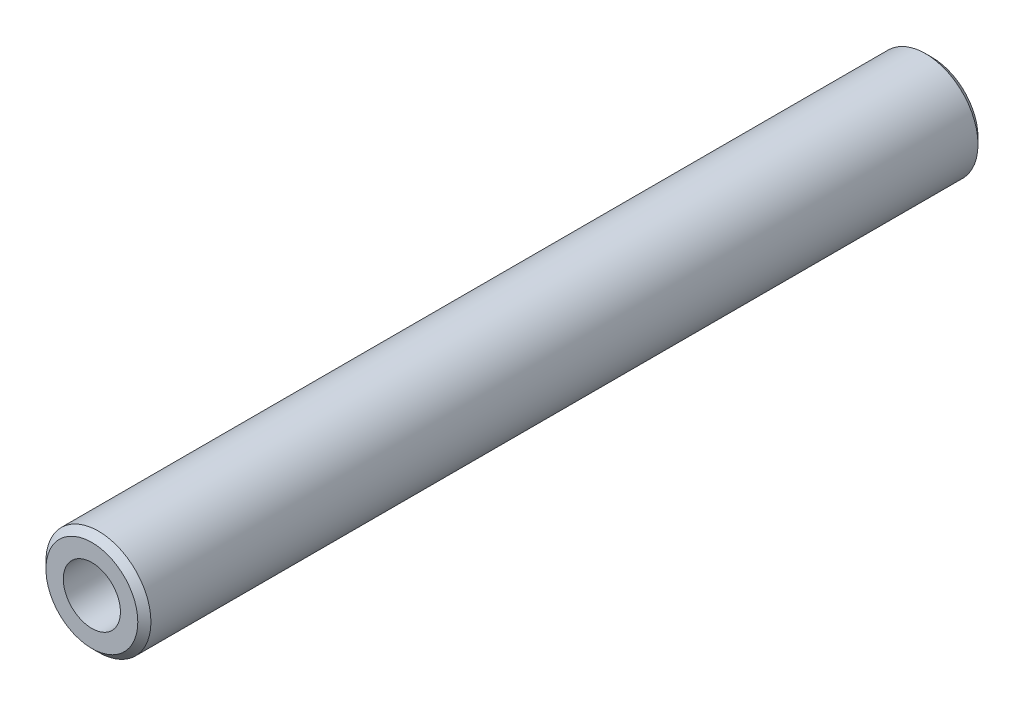
ISO-10303-21;
HEADER;
FILE_DESCRIPTION(('STEP AP214'),'2;1');
FILE_NAME('part.step','',(''),(''),'','','');
FILE_SCHEMA(('AUTOMOTIVE_DESIGN { 1 0 10303 214 1 1 1 1 }'));
ENDSEC;
DATA;
#1=APPLICATION_CONTEXT('core data for automotive mechanical design processes');
#2=APPLICATION_PROTOCOL_DEFINITION('international standard','automotive_design',2000,#1);
#3=PRODUCT_CONTEXT('',#1,'mechanical');
#4=PRODUCT('Part','Part','',(#3));
#5=PRODUCT_RELATED_PRODUCT_CATEGORY('part','',(#4));
#6=PRODUCT_DEFINITION_FORMATION('','',#4);
#7=PRODUCT_DEFINITION_CONTEXT('part definition',#1,'design');
#8=PRODUCT_DEFINITION('design','',#6,#7);
#9=PRODUCT_DEFINITION_SHAPE('','',#8);
#10=(LENGTH_UNIT() NAMED_UNIT(*) SI_UNIT(.MILLI.,.METRE.));
#11=(NAMED_UNIT(*) PLANE_ANGLE_UNIT() SI_UNIT($,.RADIAN.));
#12=(NAMED_UNIT(*) SI_UNIT($,.STERADIAN.) SOLID_ANGLE_UNIT());
#13=UNCERTAINTY_MEASURE_WITH_UNIT(LENGTH_MEASURE(1.E-05),#10,'distance_accuracy_value','');
#14=(GEOMETRIC_REPRESENTATION_CONTEXT(3) GLOBAL_UNCERTAINTY_ASSIGNED_CONTEXT((#13)) GLOBAL_UNIT_ASSIGNED_CONTEXT((#10,
#11,#12)) REPRESENTATION_CONTEXT('',''));
#15=CARTESIAN_POINT('',(0.,0.,0.));
#16=DIRECTION('',(0.,0.,1.));
#17=DIRECTION('',(1.,0.,0.));
#18=AXIS2_PLACEMENT_3D('',#15,#16,#17);
#19=CARTESIAN_POINT('',(0.,0.,25.4));
#20=DIRECTION('',(0.,0.,-1.));
#21=DIRECTION('',(-1.,0.,0.));
#22=AXIS2_PLACEMENT_3D('',#19,#20,#21);
#23=CYLINDRICAL_SURFACE('',#22,3.175);
#24=CARTESIAN_POINT('',(0.,0.,-25.003125));
#25=DIRECTION('',(0.,0.,1.));
#26=DIRECTION('',(1.,0.,0.));
#27=AXIS2_PLACEMENT_3D('',#24,#25,#26);
#28=CIRCLE('',#27,3.175);
#29=CARTESIAN_POINT('',(3.175,0.,-25.003125));
#30=VERTEX_POINT('',#29);
#31=EDGE_CURVE('E73',#30,#30,#28,.T.);
#32=ORIENTED_EDGE('',*,*,#31,.T.);
#33=EDGE_LOOP('',(#32));
#34=FACE_BOUND('',#33,.T.);
#35=CARTESIAN_POINT('',(0.,0.,25.003125));
#36=DIRECTION('',(0.,0.,1.));
#37=DIRECTION('',(1.,0.,0.));
#38=AXIS2_PLACEMENT_3D('',#35,#36,#37);
#39=CIRCLE('',#38,3.175);
#40=CARTESIAN_POINT('',(3.175,0.,25.003125));
#41=VERTEX_POINT('',#40);
#42=EDGE_CURVE('E70',#41,#41,#39,.F.);
#43=ORIENTED_EDGE('',*,*,#42,.T.);
#44=EDGE_LOOP('',(#43));
#45=FACE_BOUND('',#44,.T.);
#46=ADVANCED_FACE('F35',(#34,#45),#23,.T.);
#47=CARTESIAN_POINT('',(0.,0.,25.4));
#48=DIRECTION('',(0.,0.,1.));
#49=DIRECTION('',(1.,0.,0.));
#50=AXIS2_PLACEMENT_3D('',#47,#48,#49);
#51=PLANE('',#50);
#52=CARTESIAN_POINT('',(0.,0.,25.4));
#53=DIRECTION('',(0.,0.,1.));
#54=DIRECTION('',(1.,0.,0.));
#55=AXIS2_PLACEMENT_3D('',#52,#53,#54);
#56=CIRCLE('',#55,2.77812499999999);
#57=CARTESIAN_POINT('',(2.77812499999999,0.,25.4));
#58=VERTEX_POINT('',#57);
#59=EDGE_CURVE('E11',#58,#58,#56,.T.);
#60=ORIENTED_EDGE('',*,*,#59,.T.);
#61=EDGE_LOOP('',(#60));
#62=FACE_BOUND('',#61,.T.);
#63=CARTESIAN_POINT('',(0.,0.,25.4));
#64=DIRECTION('',(0.,0.,1.));
#65=DIRECTION('',(1.,0.,0.));
#66=AXIS2_PLACEMENT_3D('',#63,#64,#65);
#67=CIRCLE('',#66,1.72719999999999);
#68=CARTESIAN_POINT('',(1.72719999999999,0.,25.4));
#69=VERTEX_POINT('',#68);
#70=EDGE_CURVE('E60',#69,#69,#67,.T.);
#71=ORIENTED_EDGE('',*,*,#70,.F.);
#72=EDGE_LOOP('',(#71));
#73=FACE_BOUND('',#72,.T.);
#74=ADVANCED_FACE('F88',(#62,#73),#51,.T.);
#75=CARTESIAN_POINT('',(0.,0.,-25.4));
#76=DIRECTION('',(0.,0.,1.));
#77=DIRECTION('',(1.,0.,0.));
#78=AXIS2_PLACEMENT_3D('',#75,#76,#77);
#79=PLANE('',#78);
#80=CARTESIAN_POINT('',(0.,0.,-25.4));
#81=DIRECTION('',(0.,0.,1.));
#82=DIRECTION('',(1.,0.,0.));
#83=AXIS2_PLACEMENT_3D('',#80,#81,#82);
#84=CIRCLE('',#83,2.77812500000001);
#85=CARTESIAN_POINT('',(2.77812500000001,0.,-25.4));
#86=VERTEX_POINT('',#85);
#87=EDGE_CURVE('E43',#86,#86,#84,.F.);
#88=ORIENTED_EDGE('',*,*,#87,.T.);
#89=EDGE_LOOP('',(#88));
#90=FACE_BOUND('',#89,.T.);
#91=CARTESIAN_POINT('',(0.,0.,-25.4));
#92=DIRECTION('',(0.,0.,-1.));
#93=DIRECTION('',(-1.,0.,0.));
#94=AXIS2_PLACEMENT_3D('',#91,#92,#93);
#95=CIRCLE('',#94,1.72719999999999);
#96=CARTESIAN_POINT('',(-1.72719999999999,0.,-25.4));
#97=VERTEX_POINT('',#96);
#98=EDGE_CURVE('E59',#97,#97,#95,.T.);
#99=ORIENTED_EDGE('',*,*,#98,.F.);
#100=EDGE_LOOP('',(#99));
#101=FACE_BOUND('',#100,.T.);
#102=ADVANCED_FACE('F78',(#90,#101),#79,.F.);
#103=CARTESIAN_POINT('',(0.,0.,-19.05));
#104=DIRECTION('',(0.,0.,-1.));
#105=DIRECTION('',(-1.,0.,0.));
#106=AXIS2_PLACEMENT_3D('',#103,#104,#105);
#107=CONICAL_SURFACE('',#106,1.7272,1.02974425867666);
#108=CARTESIAN_POINT('',(0.,0.,-18.0121935388156));
#109=VERTEX_POINT('',#108);
#110=VERTEX_LOOP('',#109);
#111=FACE_BOUND('',#110,.T.);
#112=CARTESIAN_POINT('',(0.,0.,-19.05));
#113=DIRECTION('',(0.,0.,-1.));
#114=DIRECTION('',(-1.,0.,0.));
#115=AXIS2_PLACEMENT_3D('',#112,#113,#114);
#116=CIRCLE('',#115,1.7272);
#117=CARTESIAN_POINT('',(-1.7272,0.,-19.05));
#118=VERTEX_POINT('',#117);
#119=EDGE_CURVE('E63',#118,#118,#116,.T.);
#120=ORIENTED_EDGE('',*,*,#119,.T.);
#121=EDGE_LOOP('',(#120));
#122=FACE_BOUND('',#121,.T.);
#123=ADVANCED_FACE('F108',(#111,#122),#107,.F.);
#124=CARTESIAN_POINT('',(0.,0.,-25.4));
#125=DIRECTION('',(0.,0.,-1.));
#126=DIRECTION('',(-1.,0.,0.));
#127=AXIS2_PLACEMENT_3D('',#124,#125,#126);
#128=CYLINDRICAL_SURFACE('',#127,1.72719999999999);
#129=ORIENTED_EDGE('',*,*,#119,.F.);
#130=EDGE_LOOP('',(#129));
#131=FACE_BOUND('',#130,.T.);
#132=ORIENTED_EDGE('',*,*,#98,.T.);
#133=EDGE_LOOP('',(#132));
#134=FACE_BOUND('',#133,.T.);
#135=ADVANCED_FACE('F53',(#131,#134),#128,.F.);
#136=CARTESIAN_POINT('',(0.,0.,19.05));
#137=DIRECTION('',(0.,0.,1.));
#138=DIRECTION('',(1.,0.,0.));
#139=AXIS2_PLACEMENT_3D('',#136,#137,#138);
#140=CONICAL_SURFACE('',#139,1.7272,1.02974425867666);
#141=CARTESIAN_POINT('',(0.,0.,18.0121935388156));
#142=VERTEX_POINT('',#141);
#143=VERTEX_LOOP('',#142);
#144=FACE_BOUND('',#143,.T.);
#145=CARTESIAN_POINT('',(0.,0.,19.05));
#146=DIRECTION('',(0.,0.,1.));
#147=DIRECTION('',(1.,0.,0.));
#148=AXIS2_PLACEMENT_3D('',#145,#146,#147);
#149=CIRCLE('',#148,1.7272);
#150=CARTESIAN_POINT('',(1.7272,0.,19.05));
#151=VERTEX_POINT('',#150);
#152=EDGE_CURVE('E57',#151,#151,#149,.T.);
#153=ORIENTED_EDGE('',*,*,#152,.T.);
#154=EDGE_LOOP('',(#153));
#155=FACE_BOUND('',#154,.T.);
#156=ADVANCED_FACE('F49',(#144,#155),#140,.F.);
#157=CARTESIAN_POINT('',(0.,0.,25.4));
#158=DIRECTION('',(0.,0.,1.));
#159=DIRECTION('',(1.,0.,0.));
#160=AXIS2_PLACEMENT_3D('',#157,#158,#159);
#161=CYLINDRICAL_SURFACE('',#160,1.72719999999999);
#162=ORIENTED_EDGE('',*,*,#152,.F.);
#163=EDGE_LOOP('',(#162));
#164=FACE_BOUND('',#163,.T.);
#165=ORIENTED_EDGE('',*,*,#70,.T.);
#166=EDGE_LOOP('',(#165));
#167=FACE_BOUND('',#166,.T.);
#168=ADVANCED_FACE('F52',(#164,#167),#161,.F.);
#169=CARTESIAN_POINT('',(0.,0.,-25.003125));
#170=DIRECTION('',(0.,0.,1.));
#171=DIRECTION('',(1.,0.,0.));
#172=AXIS2_PLACEMENT_3D('',#169,#170,#171);
#173=CONICAL_SURFACE('',#172,3.175,0.785398163397452);
#174=ORIENTED_EDGE('',*,*,#87,.F.);
#175=EDGE_LOOP('',(#174));
#176=FACE_BOUND('',#175,.T.);
#177=ORIENTED_EDGE('',*,*,#31,.F.);
#178=EDGE_LOOP('',(#177));
#179=FACE_BOUND('',#178,.T.);
#180=ADVANCED_FACE('F81',(#176,#179),#173,.T.);
#181=CARTESIAN_POINT('',(0.,0.,25.4));
#182=DIRECTION('',(0.,0.,-1.));
#183=DIRECTION('',(-1.,0.,0.));
#184=AXIS2_PLACEMENT_3D('',#181,#182,#183);
#185=CONICAL_SURFACE('',#184,2.77812499999999,0.785398163397443);
#186=ORIENTED_EDGE('',*,*,#42,.F.);
#187=EDGE_LOOP('',(#186));
#188=FACE_BOUND('',#187,.T.);
#189=ORIENTED_EDGE('',*,*,#59,.F.);
#190=EDGE_LOOP('',(#189));
#191=FACE_BOUND('',#190,.T.);
#192=ADVANCED_FACE('F37',(#188,#191),#185,.T.);
#193=CLOSED_SHELL('',(#46,#74,#102,#123,#135,#156,#168,#180,#192));
#194=MANIFOLD_SOLID_BREP('B2',#193);
#195=ADVANCED_BREP_SHAPE_REPRESENTATION('',(#18,#194),#14);
#196=SHAPE_DEFINITION_REPRESENTATION(#9,#195);
ENDSEC;
END-ISO-10303-21;
